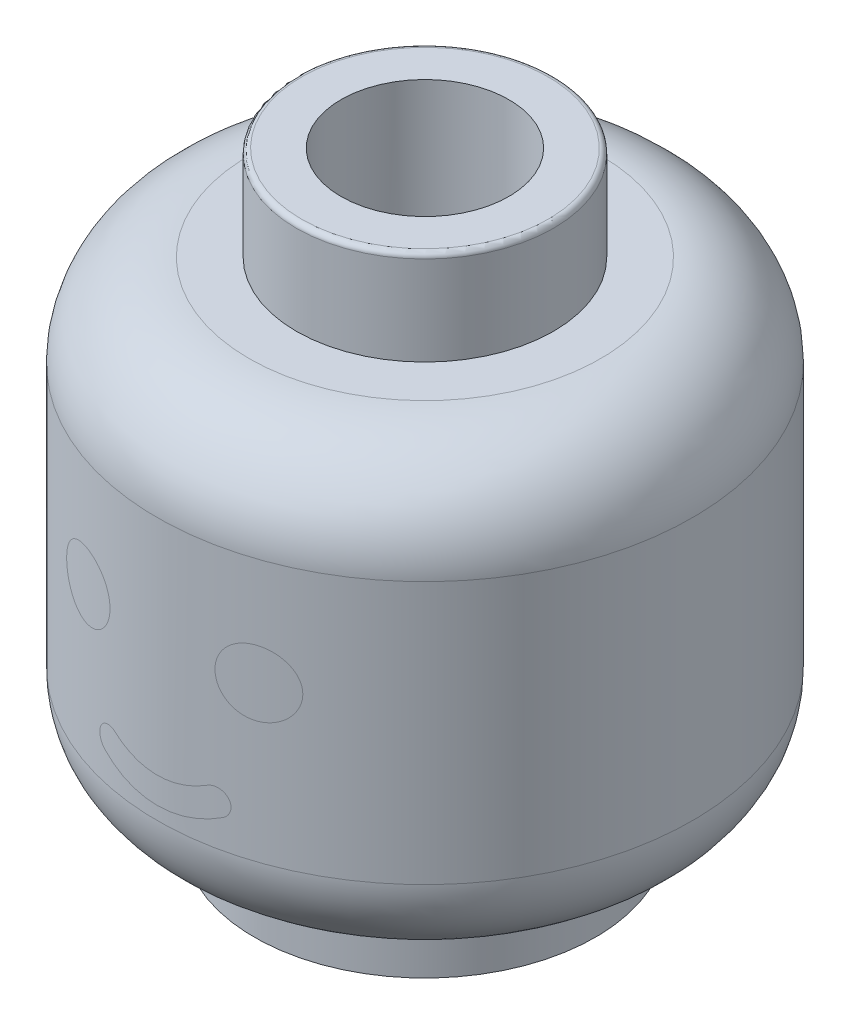
ISO-10303-21;
HEADER;
FILE_DESCRIPTION(('STEP AP214'),'2;1');
FILE_NAME('part.step','',(''),(''),'','','');
FILE_SCHEMA(('AUTOMOTIVE_DESIGN { 1 0 10303 214 1 1 1 1 }'));
ENDSEC;
DATA;
#1=APPLICATION_CONTEXT('core data for automotive mechanical design processes');
#2=APPLICATION_PROTOCOL_DEFINITION('international standard','automotive_design',2000,#1);
#3=PRODUCT_CONTEXT('',#1,'mechanical');
#4=PRODUCT('Part','Part','',(#3));
#5=PRODUCT_RELATED_PRODUCT_CATEGORY('part','',(#4));
#6=PRODUCT_DEFINITION_FORMATION('','',#4);
#7=PRODUCT_DEFINITION_CONTEXT('part definition',#1,'design');
#8=PRODUCT_DEFINITION('design','',#6,#7);
#9=PRODUCT_DEFINITION_SHAPE('','',#8);
#10=(LENGTH_UNIT() NAMED_UNIT(*) SI_UNIT(.MILLI.,.METRE.));
#11=(NAMED_UNIT(*) PLANE_ANGLE_UNIT() SI_UNIT($,.RADIAN.));
#12=(NAMED_UNIT(*) SI_UNIT($,.STERADIAN.) SOLID_ANGLE_UNIT());
#13=UNCERTAINTY_MEASURE_WITH_UNIT(LENGTH_MEASURE(1.E-05),#10,'distance_accuracy_value','');
#14=(GEOMETRIC_REPRESENTATION_CONTEXT(3) GLOBAL_UNCERTAINTY_ASSIGNED_CONTEXT((#13)) GLOBAL_UNIT_ASSIGNED_CONTEXT((#10,
#11,#12)) REPRESENTATION_CONTEXT('',''));
#15=CARTESIAN_POINT('',(0.,0.,0.));
#16=DIRECTION('',(0.,0.,1.));
#17=DIRECTION('',(1.,0.,0.));
#18=AXIS2_PLACEMENT_3D('',#15,#16,#17);
#19=CARTESIAN_POINT('',(0.,9.4,0.));
#20=DIRECTION('',(0.,1.,0.));
#21=DIRECTION('',(0.,0.,1.));
#22=AXIS2_PLACEMENT_3D('',#19,#20,#21);
#23=PLANE('',#22);
#24=DIRECTION('',(-0.866025403784443,0.,-0.499999999999992));
#25=VECTOR('',#24,1.);
#26=CARTESIAN_POINT('',(0.419999999999997,9.4,-0.242487113059647));
#27=LINE('',#26,#25);
#28=CARTESIAN_POINT('',(1.54704898937923,9.4,0.408214924348333));
#29=VERTEX_POINT('',#28);
#30=CARTESIAN_POINT('',(0.419999999999997,9.4,-0.242487113059647));
#31=VERTEX_POINT('',#30);
#32=EDGE_CURVE('E135',#29,#31,#27,.T.);
#33=ORIENTED_EDGE('',*,*,#32,.T.);
#34=DIRECTION('',(0.,0.,-1.));
#35=VECTOR('',#34,1.);
#36=CARTESIAN_POINT('',(0.419999999999978,9.4,-1.54389118787563));
#37=LINE('',#36,#35);
#38=CARTESIAN_POINT('',(0.419999999999978,9.4,-1.54389118787563));
#39=VERTEX_POINT('',#38);
#40=EDGE_CURVE('E126',#31,#39,#37,.T.);
#41=ORIENTED_EDGE('',*,*,#40,.T.);
#42=CARTESIAN_POINT('',(0.,9.4,0.));
#43=DIRECTION('',(0.,1.,0.));
#44=DIRECTION('',(0.,0.,1.));
#45=AXIS2_PLACEMENT_3D('',#42,#43,#44);
#46=CIRCLE('',#45,1.6);
#47=CARTESIAN_POINT('',(-0.42,9.4,-1.54389118787562));
#48=VERTEX_POINT('',#47);
#49=EDGE_CURVE('E134',#39,#48,#46,.T.);
#50=ORIENTED_EDGE('',*,*,#49,.T.);
#51=DIRECTION('',(0.,0.,1.));
#52=VECTOR('',#51,1.);
#53=CARTESIAN_POINT('',(-0.42,9.4,-0.242487113059642));
#54=LINE('',#53,#52);
#55=CARTESIAN_POINT('',(-0.42,9.4,-0.242487113059642));
#56=VERTEX_POINT('',#55);
#57=EDGE_CURVE('E170',#48,#56,#54,.T.);
#58=ORIENTED_EDGE('',*,*,#57,.T.);
#59=DIRECTION('',(-0.866025403784436,0.,0.500000000000004));
#60=VECTOR('',#59,1.);
#61=CARTESIAN_POINT('',(-1.54704898937922,9.4,0.408214924348355));
#62=LINE('',#61,#60);
#63=CARTESIAN_POINT('',(-1.54704898937922,9.4,0.408214924348354));
#64=VERTEX_POINT('',#63);
#65=EDGE_CURVE('E187',#56,#64,#62,.T.);
#66=ORIENTED_EDGE('',*,*,#65,.T.);
#67=CARTESIAN_POINT('',(-1.12704898937922,9.4,1.13567626352728));
#68=VERTEX_POINT('',#67);
#69=EDGE_CURVE('E204',#64,#68,#46,.T.);
#70=ORIENTED_EDGE('',*,*,#69,.T.);
#71=DIRECTION('',(0.866025403784436,0.,-0.500000000000004));
#72=VECTOR('',#71,1.);
#73=CARTESIAN_POINT('',(0.,9.4,0.484974226119285));
#74=LINE('',#73,#72);
#75=CARTESIAN_POINT('',(0.,9.4,0.484974226119285));
#76=VERTEX_POINT('',#75);
#77=EDGE_CURVE('E154',#68,#76,#74,.T.);
#78=ORIENTED_EDGE('',*,*,#77,.T.);
#79=DIRECTION('',(0.866025403784443,0.,0.499999999999992));
#80=VECTOR('',#79,1.);
#81=CARTESIAN_POINT('',(1.12704898937923,9.4,1.13567626352727));
#82=LINE('',#81,#80);
#83=CARTESIAN_POINT('',(1.12704898937923,9.4,1.13567626352727));
#84=VERTEX_POINT('',#83);
#85=EDGE_CURVE('E167',#76,#84,#82,.T.);
#86=ORIENTED_EDGE('',*,*,#85,.T.);
#87=EDGE_CURVE('E200',#84,#29,#46,.T.);
#88=ORIENTED_EDGE('',*,*,#87,.T.);
#89=EDGE_LOOP('',(#33,#41,#50,#58,#66,#70,#78,#86,#88));
#90=FACE_BOUND('',#89,.T.);
#91=ADVANCED_FACE('F36',(#90),#23,.T.);
#92=CARTESIAN_POINT('',(0.,0.,0.));
#93=DIRECTION('',(0.,-1.,0.));
#94=DIRECTION('',(0.,0.,-1.));
#95=AXIS2_PLACEMENT_3D('',#92,#93,#94);
#96=CYLINDRICAL_SURFACE('',#95,5.1);
#97=CARTESIAN_POINT('',(0.875000000000001,3.83445554337723,5.0243780709656));
#98=CARTESIAN_POINT('',(0.834164436280925,3.81088049752348,5.03149100963561));
#99=CARTESIAN_POINT('',(0.792347844589759,3.78893844223863,5.03825831000549));
#100=CARTESIAN_POINT('',(0.706965208696133,3.74845814129846,5.05094683060711));
#101=CARTESIAN_POINT('',(0.66339880943275,3.72992059076176,5.05686787799957));
#102=CARTESIAN_POINT('',(0.530503627881056,3.67966677176317,5.07311487801817));
#103=CARTESIAN_POINT('',(0.43890058846477,3.65326409982503,5.08193876661321));
#104=CARTESIAN_POINT('',(0.252167371311598,3.61563911749123,5.09462377308676));
#105=CARTESIAN_POINT('',(0.157031617465066,3.60444195365849,5.09847666951475));
#106=CARTESIAN_POINT('',(-0.0338435259914939,3.59772661788917,5.10077941625791));
#107=CARTESIAN_POINT('',(-0.129582682402315,3.60220272000981,5.09923123975764));
#108=CARTESIAN_POINT('',(-0.31669351817545,3.62636508485874,5.09100139919587));
#109=CARTESIAN_POINT('',(-0.408114966530228,3.64571210384434,5.08443424960048));
#110=CARTESIAN_POINT('',(-0.586288365896085,3.69852240222104,5.06697757552819));
#111=CARTESIAN_POINT('',(-0.673045563744544,3.73196942924805,5.05609302834729));
#112=CARTESIAN_POINT('',(-0.776531562683269,3.78155988530873,5.04057755815767));
#113=CARTESIAN_POINT('',(-0.7965419111866,3.79162783876802,5.03745232543941));
#114=CARTESIAN_POINT('',(-0.83610640638027,3.81249434086526,5.03103611531888));
#115=CARTESIAN_POINT('',(-0.855661273279768,3.82329161347498,5.0277454298491));
#116=CARTESIAN_POINT('',(-0.875,3.83445554337723,5.0243780709656));
#117=B_SPLINE_CURVE_WITH_KNOTS('',3,(#97,#98,#99,#100,#101,#102,#103,#104,#105,#106,#107,#108,
#109,#110,#111,#112,#113,#114,#115,#116),.UNSPECIFIED.,.F.,.F.,(4,2,2,2,2,2,2,2,2,4),(0.,
0.142977774593221,0.285984709459801,0.571727466948214,0.857942206903047,1.14405239441726,
1.42382259326841,1.703271193143,1.77111422851297,1.8388414943344),.UNSPECIFIED.);
#118=CARTESIAN_POINT('',(0.875000000000001,3.83445554337723,5.0243780709656));
#119=VERTEX_POINT('',#118);
#120=CARTESIAN_POINT('',(-0.875,3.83445554337723,5.0243780709656));
#121=VERTEX_POINT('',#120);
#122=EDGE_CURVE('E320',#119,#121,#117,.T.);
#123=ORIENTED_EDGE('',*,*,#122,.T.);
#124=CARTESIAN_POINT('',(-0.875,3.83445554337723,5.0243780709656));
#125=CARTESIAN_POINT('',(-0.887371793979468,3.84161189032588,5.02222559463594));
#126=CARTESIAN_POINT('',(-0.900340825244154,3.84767185938982,5.01991800503832));
#127=CARTESIAN_POINT('',(-0.927059864778855,3.85749135759363,5.01505118951027));
#128=CARTESIAN_POINT('',(-0.940808862372179,3.86125379267305,5.01249228622124));
#129=CARTESIAN_POINT('',(-0.968708678047118,3.86638936803659,5.00717551081821));
#130=CARTESIAN_POINT('',(-0.982859524008575,3.86776234212864,5.00441762487843));
#131=CARTESIAN_POINT('',(-1.01116411478936,3.86810032456663,4.99877535176141));
#132=CARTESIAN_POINT('',(-1.02531785967492,3.86706526981954,4.99589096127155));
#133=CARTESIAN_POINT('',(-1.0533862709173,3.86259994503797,4.99004861209086));
#134=CARTESIAN_POINT('',(-1.06729685929801,3.85914460749975,4.98709019876404));
#135=CARTESIAN_POINT('',(-1.09433736519577,3.84990742838682,4.98122648358215));
#136=CARTESIAN_POINT('',(-1.10746716175147,3.84412522740335,4.97832119000449));
#137=CARTESIAN_POINT('',(-1.13262058247588,3.83035938373142,4.97265900803936));
#138=CARTESIAN_POINT('',(-1.14463985912168,3.82236754054938,4.9699027191095));
#139=CARTESIAN_POINT('',(-1.16716110363957,3.80440187116274,4.9646620075731));
#140=CARTESIAN_POINT('',(-1.17766322756655,3.7944282490557,4.96217755701155));
#141=CARTESIAN_POINT('',(-1.19669465521119,3.77291577884772,4.95762207076145));
#142=CARTESIAN_POINT('',(-1.20524885165249,3.76140006781182,4.95554587116217));
#143=CARTESIAN_POINT('',(-1.2202885675878,3.7370205158325,4.9518638926501));
#144=CARTESIAN_POINT('',(-1.22677439020682,3.72415687279911,4.95025804480897));
#145=CARTESIAN_POINT('',(-1.23731153938216,3.69781783607033,4.94763468769716));
#146=CARTESIAN_POINT('',(-1.24142374817177,3.68436826145712,4.94660249306853));
#147=CARTESIAN_POINT('',(-1.2473386841379,3.65694020257054,4.94511432232711));
#148=CARTESIAN_POINT('',(-1.24914178969092,3.6429618053382,4.94465825180907));
#149=CARTESIAN_POINT('',(-1.25036114021336,3.61522854845824,4.94435004554774));
#150=CARTESIAN_POINT('',(-1.24983303828501,3.601476261082,4.94448382810274));
#151=CARTESIAN_POINT('',(-1.2465345533237,3.57426222014632,4.9453164149885));
#152=CARTESIAN_POINT('',(-1.24376437901751,3.56080043966178,4.94601516672318));
#153=CARTESIAN_POINT('',(-1.23609106012093,3.5346032456278,4.94793839100754));
#154=CARTESIAN_POINT('',(-1.23119710230879,3.52186496786532,4.949160598966));
#155=CARTESIAN_POINT('',(-1.21943147563355,3.49739112018165,4.95207263598187));
#156=CARTESIAN_POINT('',(-1.2125590826936,3.48565591941425,4.95376263623533));
#157=CARTESIAN_POINT('',(-1.19690134031722,3.46328911077548,4.95756928685665));
#158=CARTESIAN_POINT('',(-1.18808309735189,3.45268180229299,4.95969322021645));
#159=CARTESIAN_POINT('',(-1.16887719960701,3.43310324751312,4.96425449031675));
#160=CARTESIAN_POINT('',(-1.15849150543121,3.42412998782294,4.96669143497619));
#161=CARTESIAN_POINT('',(-1.14023874760394,3.41079251405107,4.97090652795668));
#162=CARTESIAN_POINT('',(-1.13273529764303,3.40590499349084,4.9726226993017));
#163=CARTESIAN_POINT('',(-1.125,3.40144284148501,4.97437181963713));
#164=B_SPLINE_CURVE_WITH_KNOTS('',3,(#124,#125,#126,#127,#128,#129,#130,#131,#132,#133,#134,
#135,#136,#137,#138,#139,#140,#141,#142,#143,#144,#145,#146,#147,#148,#149,#150,#151,#152,#153,
#154,#155,#156,#157,#158,#159,#160,#161,#162,#163),.UNSPECIFIED.,.F.,.F.,(4,2,2,2,2,2,2,2,2,2,2,
2,2,2,2,2,2,2,2,4),(0.,0.0432964300031916,0.0865379842893045,0.129782545996899,
0.173028240772797,0.2167285958122,0.260435703427691,0.304307247376252,0.348174275463554,
0.391444586081846,0.434708552417919,0.476806902772313,0.518898353882955,0.559990458102317,
0.601078737273161,0.64199102676717,0.682918308607407,0.724599191076423,0.766228363734424,
0.793527918289852),.UNSPECIFIED.);
#165=CARTESIAN_POINT('',(-1.125,3.40144284148502,4.97437181963713));
#166=VERTEX_POINT('',#165);
#167=EDGE_CURVE('E208',#121,#166,#164,.T.);
#168=ORIENTED_EDGE('',*,*,#167,.T.);
#169=CARTESIAN_POINT('',(-1.125,3.40144284148502,4.97437181963713));
#170=CARTESIAN_POINT('',(-1.07392735204476,3.3719583579169,4.98592412552557));
#171=CARTESIAN_POINT('',(-1.02162134379315,3.34443642841755,4.99692384947784));
#172=CARTESIAN_POINT('',(-0.914772205039753,3.29349759120265,5.01758462706758));
#173=CARTESIAN_POINT('',(-0.860228320479516,3.27008208140849,5.02724522460141));
#174=CARTESIAN_POINT('',(-0.6936603634674,3.20630197843225,5.05385291199249));
#175=CARTESIAN_POINT('',(-0.578679160673211,3.17239175102317,5.06843075392214));
#176=CARTESIAN_POINT('',(-0.343836701569872,3.12318267685322,5.08976616301442));
#177=CARTESIAN_POINT('',(-0.223964564545564,3.10792795994343,5.09650518551788));
#178=CARTESIAN_POINT('',(0.0167749322450367,3.0968442934725,5.10139030813886));
#179=CARTESIAN_POINT('',(0.137641329911959,3.10099836605598,5.09954391835996));
#180=CARTESIAN_POINT('',(0.372544852768561,3.12801449726199,5.0876895268438));
#181=CARTESIAN_POINT('',(0.486673534134241,3.15022378949166,5.07796634418309));
#182=CARTESIAN_POINT('',(0.70940931669795,3.21164460444894,5.0516627621416));
#183=CARTESIAN_POINT('',(0.818019156601206,3.25084760021018,5.03508580198764));
#184=CARTESIAN_POINT('',(0.957225886936982,3.31341547626634,5.00948888390476));
#185=CARTESIAN_POINT('',(0.991502231445824,3.32988385291635,5.00281111664259));
#186=CARTESIAN_POINT('',(1.05901769647691,3.36444915483163,4.98895389551433));
#187=CARTESIAN_POINT('',(1.09225901036436,3.38254226847989,4.98177562424215));
#188=CARTESIAN_POINT('',(1.12500000000001,3.40144284148499,4.97437181963713));
#189=B_SPLINE_CURVE_WITH_KNOTS('',3,(#169,#170,#171,#172,#173,#174,#175,#176,#177,#178,#179,
#180,#181,#182,#183,#184,#185,#186,#187,#188),.UNSPECIFIED.,.F.,.F.,(4,2,2,2,2,2,2,2,2,4),(0.,
0.18018627349106,0.360433768038077,0.720855984508415,1.08212914544494,1.44308634156823,
1.79154497487549,2.13982896338777,2.2556209280237,2.37114800911496),.UNSPECIFIED.);
#190=CARTESIAN_POINT('',(1.125,3.40144284148501,4.97437181963713));
#191=VERTEX_POINT('',#190);
#192=EDGE_CURVE('E332',#166,#191,#189,.T.);
#193=ORIENTED_EDGE('',*,*,#192,.T.);
#194=CARTESIAN_POINT('',(1.125,3.40144284148501,4.97437181963713));
#195=CARTESIAN_POINT('',(1.13716081478622,3.40845137343036,4.9716223804379));
#196=CARTESIAN_POINT('',(1.1487358996211,3.41651114654839,4.96895680479547));
#197=CARTESIAN_POINT('',(1.1704131716666,3.43449261769338,4.96389513184671));
#198=CARTESIAN_POINT('',(1.18051465090312,3.44441520548367,4.9614991641955));
#199=CARTESIAN_POINT('',(1.1989409082874,3.46588606707104,4.95707892158935));
#200=CARTESIAN_POINT('',(1.20726377064395,3.47743607180735,4.95505504775002));
#201=CARTESIAN_POINT('',(1.22185052310068,3.50182848216086,4.95147833941408));
#202=CARTESIAN_POINT('',(1.22811567975787,3.51467008639098,4.9499252152077));
#203=CARTESIAN_POINT('',(1.23827803335463,3.54101458018042,4.9473927070547));
#204=CARTESIAN_POINT('',(1.24222005242811,3.55449912458908,4.94640247704257));
#205=CARTESIAN_POINT('',(1.24779390126013,3.58196925885039,4.94499937055623));
#206=CARTESIAN_POINT('',(1.24942555759097,3.59595488623613,4.94458653742444));
#207=CARTESIAN_POINT('',(1.25030994719144,3.62367913558669,4.94436297240571));
#208=CARTESIAN_POINT('',(1.24961710744629,3.63741594049061,4.94453846507086));
#209=CARTESIAN_POINT('',(1.24599600554664,3.66457058426607,4.94545219168911));
#210=CARTESIAN_POINT('',(1.24306801064931,3.67798846107403,4.94619035836334));
#211=CARTESIAN_POINT('',(1.23508739747892,3.70408587077959,4.94818914590149));
#212=CARTESIAN_POINT('',(1.23004176169731,3.71676767569775,4.94944804954579));
#213=CARTESIAN_POINT('',(1.21798634485784,3.74110101291393,4.95242845896087));
#214=CARTESIAN_POINT('',(1.21097635926816,3.75275243776054,4.9541500129029));
#215=CARTESIAN_POINT('',(1.19505563947278,3.7749302481124,4.95801473732174));
#216=CARTESIAN_POINT('',(1.18611217444627,3.7854318647845,4.96016511111878));
#217=CARTESIAN_POINT('',(1.16666530730711,3.80479412045166,4.96477509632718));
#218=CARTESIAN_POINT('',(1.1561616930271,3.81365453588816,4.96723474979101));
#219=CARTESIAN_POINT('',(1.13357483159417,3.82973972281286,4.97243862180976));
#220=CARTESIAN_POINT('',(1.12145597318891,3.83691256994625,4.97518882287083));
#221=CARTESIAN_POINT('',(1.09621196261841,3.84911987242397,4.98081182631213));
#222=CARTESIAN_POINT('',(1.08308673562136,3.85415416856701,4.9836846378024));
#223=CARTESIAN_POINT('',(1.05591550914695,3.86203418345876,4.98951291689665));
#224=CARTESIAN_POINT('',(1.04185638022513,3.86483433313183,4.9924688913932));
#225=CARTESIAN_POINT('',(1.01344740181333,3.86799613128861,4.99831317826902));
#226=CARTESIAN_POINT('',(0.999097453432221,3.86835693584657,5.00120146688705));
#227=CARTESIAN_POINT('',(0.970461701171136,3.86661394764592,5.0068371392492));
#228=CARTESIAN_POINT('',(0.956176361389042,3.86450059824756,5.00958393355742));
#229=CARTESIAN_POINT('',(0.928162193094747,3.85783630488362,5.01484962728933));
#230=CARTESIAN_POINT('',(0.914432518491479,3.85328922937807,5.0173688809867));
#231=CARTESIAN_POINT('',(0.892213126665928,3.84373273822947,5.02135852358233));
#232=CARTESIAN_POINT('',(0.883464228476502,3.83934791345587,5.02290471758503));
#233=CARTESIAN_POINT('',(0.875,3.83445554337723,5.0243780709656));
#234=B_SPLINE_CURVE_WITH_KNOTS('',3,(#194,#195,#196,#197,#198,#199,#200,#201,#202,#203,#204,
#205,#206,#207,#208,#209,#210,#211,#212,#213,#214,#215,#216,#217,#218,#219,#220,#221,#222,#223,
#224,#225,#226,#227,#228,#229,#230,#231,#232,#233),.UNSPECIFIED.,.F.,.F.,(4,2,2,2,2,2,2,2,2,2,2,
2,2,2,2,2,2,2,2,4),(0.,0.0428611703448275,0.085742865423625,0.128670519167903,0.171571700388239,
0.213615486024651,0.255662427516381,0.296731795213066,0.337796253020309,0.378726359860853,
0.419660730006126,0.461351541613419,0.503048028024636,0.5458959471854,0.58874705553804,
0.632451309080979,0.676170681951485,0.720059483470533,0.763878729077869,0.793533236837038),.UNSPECIFIED.);
#235=EDGE_CURVE('E338',#191,#119,#234,.T.);
#236=ORIENTED_EDGE('',*,*,#235,.T.);
#237=EDGE_LOOP('',(#123,#168,#193,#236));
#238=FACE_BOUND('',#237,.T.);
#239=ADVANCED_FACE('F247',(#238),#96,.T.);
#240=CARTESIAN_POINT('',(2.25,5.8,4.57684389071771));
#241=CARTESIAN_POINT('',(2.24999821093017,5.83268089963055,4.57684509570473));
#242=CARTESIAN_POINT('',(2.24742352409958,5.86538489408024,4.57811328492607));
#243=CARTESIAN_POINT('',(2.23723923988095,5.92982746387808,4.58309842089861));
#244=CARTESIAN_POINT('',(2.2296236871884,5.96156485082564,4.58681826402382));
#245=CARTESIAN_POINT('',(2.20972563417215,6.02307550216269,4.59643701994647));
#246=CARTESIAN_POINT('',(2.19745714026951,6.05285434958025,4.60232939146728));
#247=CARTESIAN_POINT('',(2.16872735700624,6.10984643065151,4.61593687371031));
#248=CARTESIAN_POINT('',(2.15226598984845,6.13705961668749,4.6236520182532));
#249=CARTESIAN_POINT('',(2.11478116282377,6.18965729951401,4.64092079738532));
#250=CARTESIAN_POINT('',(2.09357355176423,6.21488664973334,4.65054604251694));
#251=CARTESIAN_POINT('',(2.04774396214306,6.26149973202262,4.67090713008831));
#252=CARTESIAN_POINT('',(2.02312072258144,6.28288203709214,4.68164338232208));
#253=CARTESIAN_POINT('',(1.96863294630213,6.32325438853096,4.70483142166591));
#254=CARTESIAN_POINT('',(1.93849385989209,6.34183628921375,4.71734986328975));
#255=CARTESIAN_POINT('',(1.8756221450062,6.37363362683435,4.74269871488975));
#256=CARTESIAN_POINT('',(1.8428885923984,6.38684714122857,4.75552923488804));
#257=CARTESIAN_POINT('',(1.77374872752115,6.40817620199162,4.78176274034261));
#258=CARTESIAN_POINT('',(1.73723941258804,6.41596926971248,4.79515812651366));
#259=CARTESIAN_POINT('',(1.66319810445617,6.42494513246531,4.8213394007919));
#260=CARTESIAN_POINT('',(1.62566609584257,6.4261278278051,4.83412527970411));
#261=CARTESIAN_POINT('',(1.55088062129565,6.42171217210202,4.85863237780584));
#262=CARTESIAN_POINT('',(1.51362678405204,6.41615229647463,4.87035923138294));
#263=CARTESIAN_POINT('',(1.44036847775789,6.39829457169771,4.89252517813363));
#264=CARTESIAN_POINT('',(1.40436368656999,6.38599847381056,4.90296460514461));
#265=CARTESIAN_POINT('',(1.33639539895269,6.35556909177676,4.92191412051277));
#266=CARTESIAN_POINT('',(1.30432354450727,6.33771842593868,4.93048917679626));
#267=CARTESIAN_POINT('',(1.2435654663394,6.29646732114622,4.94616317050037));
#268=CARTESIAN_POINT('',(1.21487835175153,6.27306834741127,4.95326249671038));
#269=CARTESIAN_POINT('',(1.16310412919168,6.22252536819747,4.96566892599652));
#270=CARTESIAN_POINT('',(1.13982463085653,6.19559434810234,4.97104172369588));
#271=CARTESIAN_POINT('',(1.09808908475715,6.13801409864679,4.98042762525543));
#272=CARTESIAN_POINT('',(1.07963229089318,6.10736544550078,4.98444093946394));
#273=CARTESIAN_POINT('',(1.04858778512332,6.04409684374799,4.99106302869871));
#274=CARTESIAN_POINT('',(1.03585885464257,6.01154966776167,4.99370587652689));
#275=CARTESIAN_POINT('',(1.01598778237418,5.94472062121609,4.99778677372652));
#276=CARTESIAN_POINT('',(1.0088452568402,5.91043886998211,4.99922490585386));
#277=CARTESIAN_POINT('',(1.00042397857505,5.84150619899965,5.00091694997969));
#278=CARTESIAN_POINT('',(0.999083597488843,5.80686309715794,5.00118330864447));
#279=CARTESIAN_POINT('',(1.00214002979624,5.73784159603897,5.00057173712213));
#280=CARTESIAN_POINT('',(1.00653668886168,5.70346318966634,4.99969383771592));
#281=CARTESIAN_POINT('',(1.02091046741958,5.63602855613549,4.99677844163824));
#282=CARTESIAN_POINT('',(1.03087468424415,5.60296946061132,4.99474362589915));
#283=CARTESIAN_POINT('',(1.05605752736804,5.53902036524975,4.98947962611299));
#284=CARTESIAN_POINT('',(1.07127610288316,5.5081303444514,4.98625045360955));
#285=CARTESIAN_POINT('',(1.10654472335407,5.44927193306245,4.97854239136448));
#286=CARTESIAN_POINT('',(1.12661116930954,5.42131393245402,4.97405925097897));
#287=CARTESIAN_POINT('',(1.1709086224938,5.36919150116225,4.96381792715512));
#288=CARTESIAN_POINT('',(1.19513973935135,5.34502717037368,4.95805971015114));
#289=CARTESIAN_POINT('',(1.247331635441,5.30082520152454,4.94518893131065));
#290=CARTESIAN_POINT('',(1.27533495137311,5.28084247211134,4.93806045530358));
#291=CARTESIAN_POINT('',(1.33396784273672,5.24584159560948,4.92254494847851));
#292=CARTESIAN_POINT('',(1.36459769549665,5.23082397358702,4.914157784689));
#293=CARTESIAN_POINT('',(1.42846052470691,5.20568770075081,4.89598118116687));
#294=CARTESIAN_POINT('',(1.46174208100307,5.19571611825991,4.8861593593167));
#295=CARTESIAN_POINT('',(1.52918127815087,5.18142686044168,4.86547524519933));
#296=CARTESIAN_POINT('',(1.56333910276756,5.17711038111184,4.85461273335776));
#297=CARTESIAN_POINT('',(1.63313206050846,5.17403538725213,4.8315926381899));
#298=CARTESIAN_POINT('',(1.66876640880608,5.17552844037567,4.81939917861963));
#299=CARTESIAN_POINT('',(1.73908614337535,5.18447858695583,4.79447314128542));
#300=CARTESIAN_POINT('',(1.77377127564805,5.19193726091131,4.78174042149958));
#301=CARTESIAN_POINT('',(1.84282835380547,5.21302838649581,4.75556578085646));
#302=CARTESIAN_POINT('',(1.87711962140943,5.22691763030354,4.74211727490861));
#303=CARTESIAN_POINT('',(1.94283937523909,5.26058664283049,4.71557341915411));
#304=CARTESIAN_POINT('',(1.97426728063138,5.28036760322642,4.70247814137742));
#305=CARTESIAN_POINT('',(2.0336243769326,5.32560003480396,4.67711697517972));
#306=CARTESIAN_POINT('',(2.06152093769916,5.35109909528098,4.66485924465043));
#307=CARTESIAN_POINT('',(2.11255598263187,5.40712786786091,4.641970605721));
#308=CARTESIAN_POINT('',(2.13569478139474,5.43765724710426,4.63133958976979));
#309=CARTESIAN_POINT('',(2.17509710786169,5.50111267825925,4.61295998744394));
#310=CARTESIAN_POINT('',(2.19167582030666,5.53380504064523,4.6050822452227));
#311=CARTESIAN_POINT('',(2.2189449995419,5.60201898303534,4.5920055529927));
#312=CARTESIAN_POINT('',(2.22964830953976,5.63753419621972,4.58680076172451));
#313=CARTESIAN_POINT('',(2.24139677682865,5.69451072116627,4.58106549185679));
#314=CARTESIAN_POINT('',(2.24461602880037,5.71544364516775,4.57948736746911));
#315=CARTESIAN_POINT('',(2.24891816697547,5.75758114478951,4.57737620225752));
#316=CARTESIAN_POINT('',(2.25000116134662,5.7787857066009,4.57684310851928));
#317=CARTESIAN_POINT('',(2.25,5.8,4.57684389071771));
#318=B_SPLINE_CURVE_WITH_KNOTS('',3,(#240,#241,#242,#243,#244,#245,#246,#247,#248,#249,#250,
#251,#252,#253,#254,#255,#256,#257,#258,#259,#260,#261,#262,#263,#264,#265,#266,#267,#268,#269,
#270,#271,#272,#273,#274,#275,#276,#277,#278,#279,#280,#281,#282,#283,#284,#285,#286,#287,#288,
#289,#290,#291,#292,#293,#294,#295,#296,#297,#298,#299,#300,#301,#302,#303,#304,#305,#306,#307,
#308,#309,#310,#311,#312,#313,#314,#315,#316,#317),.UNSPECIFIED.,.T.,.F.,(4,2,2,2,2,2,2,2,2,2,2,
2,2,2,2,2,2,2,2,2,2,2,2,2,2,2,2,2,2,2,2,2,2,2,2,2,2,2,4),(0.,0.0979599375773447,
0.19603581257495,0.293818770289086,0.391603542461189,0.494184159702283,0.596802749499285,
0.708976625992396,0.821190639215509,0.939612702968071,1.0580365526597,1.1757878033801,
1.29350845600906,1.40601578351146,1.51849343265248,1.62596591030116,1.73342175149066,
1.83805966032882,1.94269038065465,2.046206979861,2.14972079449597,2.25299570765941,
2.35626962268268,2.45989794429762,2.56352899419187,2.66844555479927,2.77337320691538,
2.88120449766342,2.9890585899662,3.10163392771462,3.21423910043866,3.33179045133175,
3.4493655946871,3.56795819196073,3.68654294503193,3.79841103740179,3.91003361037509,
3.97362598739754,4.03721514438575),.UNSPECIFIED.);
#319=CARTESIAN_POINT('',(2.25,5.8,4.57684389071771));
#320=VERTEX_POINT('',#319);
#321=EDGE_CURVE('E311',#320,#320,#318,.T.);
#322=ORIENTED_EDGE('',*,*,#321,.T.);
#323=EDGE_LOOP('',(#322));
#324=FACE_BOUND('',#323,.T.);
#325=ADVANCED_FACE('F252',(#324),#96,.T.);
#326=CARTESIAN_POINT('',(-1.,5.8,5.00099990002));
#327=CARTESIAN_POINT('',(-1.00000151690153,5.834511838437,5.00099990712765));
#328=CARTESIAN_POINT('',(-1.00286876052158,5.8690463588851,5.00042890994423));
#329=CARTESIAN_POINT('',(-1.01425646627887,5.93715693314022,4.99813127779737));
#330=CARTESIAN_POINT('',(-1.02278306702181,5.97073190484821,4.99640338795486));
#331=CARTESIAN_POINT('',(-1.04521458875839,6.03592576368567,4.99175889029626));
#332=CARTESIAN_POINT('',(-1.05911613407239,6.06754586412378,4.98884302851232));
#333=CARTESIAN_POINT('',(-1.09185026684241,6.12795824840589,4.98178100126432));
#334=CARTESIAN_POINT('',(-1.11068171939305,6.15675118099229,4.97763511893192));
#335=CARTESIAN_POINT('',(-1.15277623531479,6.21086514077664,4.96805530875786));
#336=CARTESIAN_POINT('',(-1.17605952865221,6.23616937453975,4.96261547229567));
#337=CARTESIAN_POINT('',(-1.22626351158888,6.28249474903862,4.9504488375796));
#338=CARTESIAN_POINT('',(-1.25318449775082,6.30351554021618,4.94372193437907));
#339=CARTESIAN_POINT('',(-1.31032858774834,6.34110690842641,4.92888668070293));
#340=CARTESIAN_POINT('',(-1.34060084855158,6.35759401420153,4.92075640207097));
#341=CARTESIAN_POINT('',(-1.40313946905718,6.38529755291533,4.90329006920268));
#342=CARTESIAN_POINT('',(-1.43540611634181,6.3965132237193,4.89395384086089));
#343=CARTESIAN_POINT('',(-1.50214797051841,6.41380858839688,4.87389020382693));
#344=CARTESIAN_POINT('',(-1.53666096976907,6.41969957292037,4.86312614436147));
#345=CARTESIAN_POINT('',(-1.6058968164829,6.42567433524797,4.8407045714223));
#346=CARTESIAN_POINT('',(-1.6406197113844,6.42575674713349,4.82904684844376));
#347=CARTESIAN_POINT('',(-1.71101143225061,6.42010588871324,4.80456989248105));
#348=CARTESIAN_POINT('',(-1.74664840079208,6.41410007319685,4.79172183174764));
#349=CARTESIAN_POINT('',(-1.81628042291799,6.39609641984108,4.7657641451245));
#350=CARTESIAN_POINT('',(-1.85027501952491,6.38409692471699,4.75265444785392));
#351=CARTESIAN_POINT('',(-1.91694272819715,6.35387822275484,4.72616784257355));
#352=CARTESIAN_POINT('',(-1.94952527278676,6.33545217289644,4.71279811486469));
#353=CARTESIAN_POINT('',(-2.01110344261868,6.29289933745975,4.68685188814152));
#354=CARTESIAN_POINT('',(-2.04009866749996,6.26877191645562,4.67427547774164));
#355=CARTESIAN_POINT('',(-2.09319922337433,6.21569691499744,4.65073651527793));
#356=CARTESIAN_POINT('',(-2.1173665136775,6.18682044840835,4.63975408682706));
#357=CARTESIAN_POINT('',(-2.16036994898472,6.12469748254316,4.61988795561479));
#358=CARTESIAN_POINT('',(-2.17920930829465,6.09145363588584,4.61100298800605));
#359=CARTESIAN_POINT('',(-2.20941882839442,6.02433229941903,4.59659956061496));
#360=CARTESIAN_POINT('',(-2.22126265230069,5.99071388292109,4.59087008544554));
#361=CARTESIAN_POINT('',(-2.23908788005507,5.92161862047672,4.58220318037648));
#362=CARTESIAN_POINT('',(-2.24507374341309,5.88614320991995,4.57926362663521));
#363=CARTESIAN_POINT('',(-2.25059255570592,5.81790635267924,4.57655336681333));
#364=CARTESIAN_POINT('',(-2.25067299386433,5.78519870951082,4.57651380446296));
#365=CARTESIAN_POINT('',(-2.24574719214254,5.72026706328799,4.57893296336695));
#366=CARTESIAN_POINT('',(-2.24074178733327,5.68804298171654,4.58139127448252));
#367=CARTESIAN_POINT('',(-2.22608462579069,5.6258901879866,4.58853031334332));
#368=CARTESIAN_POINT('',(-2.21656498636765,5.59592266382469,4.59314779857097));
#369=CARTESIAN_POINT('',(-2.19331529867523,5.53805402711585,4.60429509999728));
#370=CARTESIAN_POINT('',(-2.17958445730978,5.51015330503984,4.61082527640283));
#371=CARTESIAN_POINT('',(-2.14751640124844,5.45553083201398,4.62585155734728));
#372=CARTESIAN_POINT('',(-2.12896763856847,5.42895795848918,4.63443592664681));
#373=CARTESIAN_POINT('',(-2.08827515536961,5.37924574298519,4.65291370695865));
#374=CARTESIAN_POINT('',(-2.06613005649317,5.35610772400706,4.6628076196059));
#375=CARTESIAN_POINT('',(-2.01661947702173,5.31167083487721,4.68444661193492));
#376=CARTESIAN_POINT('',(-1.98896042974994,5.29074093711521,4.69627827255092));
#377=CARTESIAN_POINT('',(-1.93075163098336,5.2538038262966,4.72050766328082));
#378=CARTESIAN_POINT('',(-1.90020077240919,5.23779850857771,4.73290560923961));
#379=CARTESIAN_POINT('',(-1.83468606470462,5.21007712727819,4.7587025671708));
#380=CARTESIAN_POINT('',(-1.79956293002442,5.19874398947867,4.77211042099349));
#381=CARTESIAN_POINT('',(-1.72774336013291,5.18240359060501,4.79857974928233));
#382=CARTESIAN_POINT('',(-1.69104671714969,5.17739716760989,4.81164117763434));
#383=CARTESIAN_POINT('',(-1.61664596965983,5.17393485177328,4.83714990055694));
#384=CARTESIAN_POINT('',(-1.57893511386604,5.17555573167958,4.84958829808962));
#385=CARTESIAN_POINT('',(-1.50407182859974,5.18564916048144,4.8733262954358));
#386=CARTESIAN_POINT('',(-1.46691928529337,5.19412029283641,4.88462613014563));
#387=CARTESIAN_POINT('',(-1.39576310243052,5.21739871498445,4.9054224592002));
#388=CARTESIAN_POINT('',(-1.36169374671174,5.23195875550065,4.9149703759735));
#389=CARTESIAN_POINT('',(-1.29638270127521,5.26707507364988,4.93259935455762));
#390=CARTESIAN_POINT('',(-1.26514011132263,5.2876294334138,4.94068088419624));
#391=CARTESIAN_POINT('',(-1.20800798557652,5.33308295004981,4.95495150096601));
#392=CARTESIAN_POINT('',(-1.1819342574582,5.35772825876253,4.96121244028702));
#393=CARTESIAN_POINT('',(-1.13426011235918,5.4113042057867,4.97232890416605));
#394=CARTESIAN_POINT('',(-1.11265989194766,5.44023503231115,4.97718436697015));
#395=CARTESIAN_POINT('',(-1.07529307207803,5.50055535471623,4.98538869981985));
#396=CARTESIAN_POINT('',(-1.05936427945246,5.53183882323217,4.9887801739823));
#397=CARTESIAN_POINT('',(-1.032954651942,5.59670115837605,4.99431561319897));
#398=CARTESIAN_POINT('',(-1.02246725616904,5.63027720519756,4.99646108098232));
#399=CARTESIAN_POINT('',(-1.00993089238961,5.68671149443279,4.99900623651242));
#400=CARTESIAN_POINT('',(-1.00621232443705,5.70919782959394,4.99975431794545));
#401=CARTESIAN_POINT('',(-1.00124638691545,5.75445281761336,5.00075114548123));
#402=CARTESIAN_POINT('',(-0.999998998813423,5.77722146835309,5.0009998953288));
#403=CARTESIAN_POINT('',(-1.,5.8,5.00099990002));
#404=B_SPLINE_CURVE_WITH_KNOTS('',3,(#326,#327,#328,#329,#330,#331,#332,#333,#334,#335,#336,
#337,#338,#339,#340,#341,#342,#343,#344,#345,#346,#347,#348,#349,#350,#351,#352,#353,#354,#355,
#356,#357,#358,#359,#360,#361,#362,#363,#364,#365,#366,#367,#368,#369,#370,#371,#372,#373,#374,
#375,#376,#377,#378,#379,#380,#381,#382,#383,#384,#385,#386,#387,#388,#389,#390,#391,#392,#393,
#394,#395,#396,#397,#398,#399,#400,#401,#402,#403),.UNSPECIFIED.,.T.,.F.,(4,2,2,2,2,2,2,2,2,2,2,
2,2,2,2,2,2,2,2,2,2,2,2,2,2,2,2,2,2,2,2,2,2,2,2,2,2,2,4),(0.,0.10345220201391,0.207016800604948,
0.310516461871601,0.413992317580975,0.517950069215874,0.621916301119247,0.727684988413026,
0.833468962855265,0.942869685506748,1.05229613426876,1.16684732578833,1.28143020887799,
1.40010567833363,1.51879438058107,1.63584516059708,1.75282517326617,1.86053319153262,
1.96815915061096,2.06579322859094,2.16341127811561,2.25833377892936,2.35327416749598,
2.4534281003628,2.55362050993002,2.66309505897257,2.77261168925676,2.88986568072622,
3.00713520281728,3.12576703788831,3.24437434775355,3.35857250437301,3.47273416355636,
3.58145331344499,3.69017723951884,3.79547959618473,3.90065468921569,3.96893580773281,
4.03721641416349),.UNSPECIFIED.);
#405=CARTESIAN_POINT('',(-1.,5.8,5.00099990002));
#406=VERTEX_POINT('',#405);
#407=EDGE_CURVE('E303',#406,#406,#404,.T.);
#408=ORIENTED_EDGE('',*,*,#407,.T.);
#409=EDGE_LOOP('',(#408));
#410=FACE_BOUND('',#409,.T.);
#411=ADVANCED_FACE('F254',(#410),#96,.T.);
#412=CARTESIAN_POINT('',(0.,2.85,0.));
#413=DIRECTION('',(0.,-1.,0.));
#414=DIRECTION('',(0.,0.,-1.));
#415=AXIS2_PLACEMENT_3D('',#412,#413,#414);
#416=TOROIDAL_SURFACE('',#415,3.35,1.75);
#417=CARTESIAN_POINT('',(0.,2.85,0.));
#418=DIRECTION('',(0.,-1.,0.));
#419=DIRECTION('',(0.,0.,-1.));
#420=AXIS2_PLACEMENT_3D('',#417,#418,#419);
#421=CIRCLE('',#420,5.1);
#422=CARTESIAN_POINT('',(0.,2.85,-5.1));
#423=VERTEX_POINT('',#422);
#424=EDGE_CURVE('E312',#423,#423,#421,.T.);
#425=ORIENTED_EDGE('',*,*,#424,.T.);
#426=EDGE_LOOP('',(#425));
#427=FACE_BOUND('',#426,.T.);
#428=CARTESIAN_POINT('',(0.,1.1,0.));
#429=DIRECTION('',(0.,-1.,0.));
#430=DIRECTION('',(0.,0.,-1.));
#431=AXIS2_PLACEMENT_3D('',#428,#429,#430);
#432=CIRCLE('',#431,3.35);
#433=CARTESIAN_POINT('',(0.,1.1,-3.35));
#434=VERTEX_POINT('',#433);
#435=EDGE_CURVE('E219',#434,#434,#432,.T.);
#436=ORIENTED_EDGE('',*,*,#435,.F.);
#437=EDGE_LOOP('',(#436));
#438=FACE_BOUND('',#437,.T.);
#439=ADVANCED_FACE('F295',(#427,#438),#416,.T.);
#440=ORIENTED_EDGE('',*,*,#167,.F.);
#441=ORIENTED_EDGE('',*,*,#122,.F.);
#442=ORIENTED_EDGE('',*,*,#235,.F.);
#443=ORIENTED_EDGE('',*,*,#192,.F.);
#444=EDGE_LOOP('',(#440,#441,#442,#443));
#445=FACE_BOUND('',#444,.T.);
#446=ORIENTED_EDGE('',*,*,#321,.F.);
#447=EDGE_LOOP('',(#446));
#448=FACE_BOUND('',#447,.T.);
#449=ORIENTED_EDGE('',*,*,#407,.F.);
#450=EDGE_LOOP('',(#449));
#451=FACE_BOUND('',#450,.T.);
#452=CARTESIAN_POINT('',(0.,7.85,0.));
#453=DIRECTION('',(0.,-1.,0.));
#454=DIRECTION('',(0.,0.,-1.));
#455=AXIS2_PLACEMENT_3D('',#452,#453,#454);
#456=CIRCLE('',#455,5.1);
#457=CARTESIAN_POINT('',(0.,7.85,-5.1));
#458=VERTEX_POINT('',#457);
#459=EDGE_CURVE('E393',#458,#458,#456,.T.);
#460=ORIENTED_EDGE('',*,*,#459,.T.);
#461=EDGE_LOOP('',(#460));
#462=FACE_BOUND('',#461,.T.);
#463=ORIENTED_EDGE('',*,*,#424,.F.);
#464=EDGE_LOOP('',(#463));
#465=FACE_BOUND('',#464,.T.);
#466=ADVANCED_FACE('F255',(#445,#448,#451,#462,#465),#96,.T.);
#467=CARTESIAN_POINT('',(0.,7.85,0.));
#468=DIRECTION('',(0.,-1.,0.));
#469=DIRECTION('',(0.,0.,-1.));
#470=AXIS2_PLACEMENT_3D('',#467,#468,#469);
#471=TOROIDAL_SURFACE('',#470,3.35,1.75);
#472=CARTESIAN_POINT('',(0.,9.6,0.));
#473=DIRECTION('',(0.,-1.,0.));
#474=DIRECTION('',(0.,0.,-1.));
#475=AXIS2_PLACEMENT_3D('',#472,#473,#474);
#476=CIRCLE('',#475,3.35);
#477=CARTESIAN_POINT('',(0.,9.6,-3.35));
#478=VERTEX_POINT('',#477);
#479=EDGE_CURVE('E391',#478,#478,#476,.T.);
#480=ORIENTED_EDGE('',*,*,#479,.T.);
#481=EDGE_LOOP('',(#480));
#482=FACE_BOUND('',#481,.T.);
#483=ORIENTED_EDGE('',*,*,#459,.F.);
#484=EDGE_LOOP('',(#483));
#485=FACE_BOUND('',#484,.T.);
#486=ADVANCED_FACE('F290',(#482,#485),#471,.T.);
#487=CARTESIAN_POINT('',(0.,9.6,-3.35));
#488=DIRECTION('',(0.,1.,0.));
#489=DIRECTION('',(0.,0.,1.));
#490=AXIS2_PLACEMENT_3D('',#487,#488,#489);
#491=PLANE('',#490);
#492=CARTESIAN_POINT('',(0.,9.6,0.));
#493=DIRECTION('',(0.,-1.,0.));
#494=DIRECTION('',(0.,0.,-1.));
#495=AXIS2_PLACEMENT_3D('',#492,#493,#494);
#496=CIRCLE('',#495,2.45);
#497=CARTESIAN_POINT('',(0.,9.6,-2.45));
#498=VERTEX_POINT('',#497);
#499=EDGE_CURVE('E388',#498,#498,#496,.T.);
#500=ORIENTED_EDGE('',*,*,#499,.T.);
#501=EDGE_LOOP('',(#500));
#502=FACE_BOUND('',#501,.T.);
#503=ORIENTED_EDGE('',*,*,#479,.F.);
#504=EDGE_LOOP('',(#503));
#505=FACE_BOUND('',#504,.T.);
#506=ADVANCED_FACE('F286',(#502,#505),#491,.T.);
#507=CARTESIAN_POINT('',(0.,0.,0.));
#508=DIRECTION('',(0.,-1.,0.));
#509=DIRECTION('',(0.,0.,-1.));
#510=AXIS2_PLACEMENT_3D('',#507,#508,#509);
#511=CYLINDRICAL_SURFACE('',#510,2.45);
#512=CARTESIAN_POINT('',(0.,11.3,0.));
#513=DIRECTION('',(0.,1.,0.));
#514=DIRECTION('',(0.,0.,1.));
#515=AXIS2_PLACEMENT_3D('',#512,#513,#514);
#516=CIRCLE('',#515,2.45);
#517=CARTESIAN_POINT('',(0.,11.3,2.45));
#518=VERTEX_POINT('',#517);
#519=EDGE_CURVE('E44',#518,#518,#516,.F.);
#520=ORIENTED_EDGE('',*,*,#519,.T.);
#521=EDGE_LOOP('',(#520));
#522=FACE_BOUND('',#521,.T.);
#523=ORIENTED_EDGE('',*,*,#499,.F.);
#524=EDGE_LOOP('',(#523));
#525=FACE_BOUND('',#524,.T.);
#526=ADVANCED_FACE('F282',(#522,#525),#511,.T.);
#527=CARTESIAN_POINT('',(0.,11.4,-2.45));
#528=DIRECTION('',(0.,1.,0.));
#529=DIRECTION('',(0.,0.,1.));
#530=AXIS2_PLACEMENT_3D('',#527,#528,#529);
#531=PLANE('',#530);
#532=CARTESIAN_POINT('',(0.,11.4,0.));
#533=DIRECTION('',(0.,1.,0.));
#534=DIRECTION('',(0.,0.,1.));
#535=AXIS2_PLACEMENT_3D('',#532,#533,#534);
#536=CIRCLE('',#535,2.35);
#537=CARTESIAN_POINT('',(0.,11.4,2.35));
#538=VERTEX_POINT('',#537);
#539=EDGE_CURVE('E11',#538,#538,#536,.T.);
#540=ORIENTED_EDGE('',*,*,#539,.T.);
#541=EDGE_LOOP('',(#540));
#542=FACE_BOUND('',#541,.T.);
#543=CARTESIAN_POINT('',(0.,11.4,0.));
#544=DIRECTION('',(0.,1.,0.));
#545=DIRECTION('',(0.,0.,1.));
#546=AXIS2_PLACEMENT_3D('',#543,#544,#545);
#547=CIRCLE('',#546,1.6);
#548=CARTESIAN_POINT('',(0.,11.4,1.6));
#549=VERTEX_POINT('',#548);
#550=EDGE_CURVE('E372',#549,#549,#547,.T.);
#551=ORIENTED_EDGE('',*,*,#550,.F.);
#552=EDGE_LOOP('',(#551));
#553=FACE_BOUND('',#552,.T.);
#554=ADVANCED_FACE('F279',(#542,#553),#531,.T.);
#555=CARTESIAN_POINT('',(0.,8.5,0.));
#556=DIRECTION('',(0.,-1.,0.));
#557=DIRECTION('',(0.,0.,-1.));
#558=AXIS2_PLACEMENT_3D('',#555,#556,#557);
#559=PLANE('',#558);
#560=CARTESIAN_POINT('',(0.,8.5,0.));
#561=DIRECTION('',(0.,-1.,0.));
#562=DIRECTION('',(0.,0.,-1.));
#563=AXIS2_PLACEMENT_3D('',#560,#561,#562);
#564=CIRCLE('',#563,1.6);
#565=CARTESIAN_POINT('',(1.54704898937923,8.5,0.408214924348333));
#566=VERTEX_POINT('',#565);
#567=CARTESIAN_POINT('',(0.419999999999978,8.5,-1.54389118787563));
#568=VERTEX_POINT('',#567);
#569=EDGE_CURVE('E132',#566,#568,#564,.F.);
#570=ORIENTED_EDGE('',*,*,#569,.T.);
#571=DIRECTION('',(0.,0.,1.));
#572=VECTOR('',#571,1.);
#573=CARTESIAN_POINT('',(0.419999999999978,8.5,-1.54389118787563));
#574=LINE('',#573,#572);
#575=CARTESIAN_POINT('',(0.419999999999997,8.5,-0.242487113059647));
#576=VERTEX_POINT('',#575);
#577=EDGE_CURVE('E118',#568,#576,#574,.T.);
#578=ORIENTED_EDGE('',*,*,#577,.T.);
#579=DIRECTION('',(0.866025403784443,0.,0.499999999999992));
#580=VECTOR('',#579,1.);
#581=CARTESIAN_POINT('',(0.419999999999997,8.5,-0.242487113059647));
#582=LINE('',#581,#580);
#583=EDGE_CURVE('E139',#576,#566,#582,.T.);
#584=ORIENTED_EDGE('',*,*,#583,.T.);
#585=EDGE_LOOP('',(#570,#578,#584));
#586=FACE_BOUND('',#585,.T.);
#587=CARTESIAN_POINT('',(0.,8.5,0.));
#588=DIRECTION('',(0.,-1.,0.));
#589=DIRECTION('',(0.,0.,-1.));
#590=AXIS2_PLACEMENT_3D('',#587,#588,#589);
#591=CIRCLE('',#590,1.6);
#592=CARTESIAN_POINT('',(-1.12704898937922,8.5,1.13567626352728));
#593=VERTEX_POINT('',#592);
#594=CARTESIAN_POINT('',(1.12704898937923,8.5,1.13567626352727));
#595=VERTEX_POINT('',#594);
#596=EDGE_CURVE('E151',#593,#595,#591,.F.);
#597=ORIENTED_EDGE('',*,*,#596,.T.);
#598=DIRECTION('',(-0.866025403784443,0.,-0.499999999999992));
#599=VECTOR('',#598,1.);
#600=CARTESIAN_POINT('',(1.12704898937923,8.5,1.13567626352727));
#601=LINE('',#600,#599);
#602=CARTESIAN_POINT('',(0.,8.5,0.484974226119285));
#603=VERTEX_POINT('',#602);
#604=EDGE_CURVE('E160',#595,#603,#601,.T.);
#605=ORIENTED_EDGE('',*,*,#604,.T.);
#606=DIRECTION('',(-0.866025403784436,0.,0.500000000000004));
#607=VECTOR('',#606,1.);
#608=CARTESIAN_POINT('',(0.,8.5,0.484974226119285));
#609=LINE('',#608,#607);
#610=EDGE_CURVE('E148',#603,#593,#609,.T.);
#611=ORIENTED_EDGE('',*,*,#610,.T.);
#612=EDGE_LOOP('',(#597,#605,#611));
#613=FACE_BOUND('',#612,.T.);
#614=CARTESIAN_POINT('',(0.,8.5,0.));
#615=DIRECTION('',(0.,-1.,0.));
#616=DIRECTION('',(0.,0.,-1.));
#617=AXIS2_PLACEMENT_3D('',#614,#615,#616);
#618=CIRCLE('',#617,1.6);
#619=CARTESIAN_POINT('',(-0.42,8.5,-1.54389118787562));
#620=VERTEX_POINT('',#619);
#621=CARTESIAN_POINT('',(-1.54704898937922,8.5,0.408214924348354));
#622=VERTEX_POINT('',#621);
#623=EDGE_CURVE('E174',#620,#622,#618,.F.);
#624=ORIENTED_EDGE('',*,*,#623,.T.);
#625=DIRECTION('',(0.866025403784436,0.,-0.500000000000004));
#626=VECTOR('',#625,1.);
#627=CARTESIAN_POINT('',(-1.54704898937922,8.5,0.408214924348355));
#628=LINE('',#627,#626);
#629=CARTESIAN_POINT('',(-0.42,8.5,-0.242487113059642));
#630=VERTEX_POINT('',#629);
#631=EDGE_CURVE('E184',#622,#630,#628,.T.);
#632=ORIENTED_EDGE('',*,*,#631,.T.);
#633=DIRECTION('',(0.,0.,-1.));
#634=VECTOR('',#633,1.);
#635=CARTESIAN_POINT('',(-0.42,8.5,-0.242487113059642));
#636=LINE('',#635,#634);
#637=EDGE_CURVE('E171',#630,#620,#636,.T.);
#638=ORIENTED_EDGE('',*,*,#637,.T.);
#639=EDGE_LOOP('',(#624,#632,#638));
#640=FACE_BOUND('',#639,.T.);
#641=CARTESIAN_POINT('',(0.,8.5,0.));
#642=DIRECTION('',(0.,-1.,0.));
#643=DIRECTION('',(0.,0.,-1.));
#644=AXIS2_PLACEMENT_3D('',#641,#642,#643);
#645=CIRCLE('',#644,2.45);
#646=CARTESIAN_POINT('',(0.,8.5,-2.45));
#647=VERTEX_POINT('',#646);
#648=EDGE_CURVE('E385',#647,#647,#645,.T.);
#649=ORIENTED_EDGE('',*,*,#648,.T.);
#650=EDGE_LOOP('',(#649));
#651=FACE_BOUND('',#650,.T.);
#652=ADVANCED_FACE('F137',(#586,#613,#640,#651),#559,.T.);
#653=CARTESIAN_POINT('',(0.,0.,0.));
#654=DIRECTION('',(0.,-1.,0.));
#655=DIRECTION('',(0.,0.,-1.));
#656=AXIS2_PLACEMENT_3D('',#653,#654,#655);
#657=CYLINDRICAL_SURFACE('',#656,2.45);
#658=CARTESIAN_POINT('',(0.,0.,0.));
#659=DIRECTION('',(0.,-1.,0.));
#660=DIRECTION('',(0.,0.,-1.));
#661=AXIS2_PLACEMENT_3D('',#658,#659,#660);
#662=CIRCLE('',#661,2.45);
#663=CARTESIAN_POINT('',(0.,0.,-2.45));
#664=VERTEX_POINT('',#663);
#665=EDGE_CURVE('E382',#664,#664,#662,.T.);
#666=ORIENTED_EDGE('',*,*,#665,.T.);
#667=EDGE_LOOP('',(#666));
#668=FACE_BOUND('',#667,.T.);
#669=ORIENTED_EDGE('',*,*,#648,.F.);
#670=EDGE_LOOP('',(#669));
#671=FACE_BOUND('',#670,.T.);
#672=ADVANCED_FACE('F272',(#668,#671),#657,.F.);
#673=CARTESIAN_POINT('',(0.,0.,-2.45));
#674=DIRECTION('',(0.,-1.,0.));
#675=DIRECTION('',(0.,0.,-1.));
#676=AXIS2_PLACEMENT_3D('',#673,#674,#675);
#677=PLANE('',#676);
#678=CARTESIAN_POINT('',(0.,0.,0.));
#679=DIRECTION('',(0.,-1.,0.));
#680=DIRECTION('',(0.,0.,-1.));
#681=AXIS2_PLACEMENT_3D('',#678,#679,#680);
#682=CIRCLE('',#681,3.25);
#683=CARTESIAN_POINT('',(0.,0.,-3.25));
#684=VERTEX_POINT('',#683);
#685=EDGE_CURVE('E379',#684,#684,#682,.T.);
#686=ORIENTED_EDGE('',*,*,#685,.T.);
#687=EDGE_LOOP('',(#686));
#688=FACE_BOUND('',#687,.T.);
#689=ORIENTED_EDGE('',*,*,#665,.F.);
#690=EDGE_LOOP('',(#689));
#691=FACE_BOUND('',#690,.T.);
#692=ADVANCED_FACE('F268',(#688,#691),#677,.T.);
#693=CARTESIAN_POINT('',(0.,0.,0.));
#694=DIRECTION('',(0.,-1.,0.));
#695=DIRECTION('',(0.,0.,-1.));
#696=AXIS2_PLACEMENT_3D('',#693,#694,#695);
#697=CYLINDRICAL_SURFACE('',#696,3.25);
#698=CARTESIAN_POINT('',(0.,1.1,0.));
#699=DIRECTION('',(0.,-1.,0.));
#700=DIRECTION('',(0.,0.,-1.));
#701=AXIS2_PLACEMENT_3D('',#698,#699,#700);
#702=CIRCLE('',#701,3.25);
#703=CARTESIAN_POINT('',(0.,1.1,-3.25));
#704=VERTEX_POINT('',#703);
#705=EDGE_CURVE('E376',#704,#704,#702,.T.);
#706=ORIENTED_EDGE('',*,*,#705,.T.);
#707=EDGE_LOOP('',(#706));
#708=FACE_BOUND('',#707,.T.);
#709=ORIENTED_EDGE('',*,*,#685,.F.);
#710=EDGE_LOOP('',(#709));
#711=FACE_BOUND('',#710,.T.);
#712=ADVANCED_FACE('F264',(#708,#711),#697,.T.);
#713=CARTESIAN_POINT('',(0.,1.1,-3.25));
#714=DIRECTION('',(0.,-1.,0.));
#715=DIRECTION('',(0.,0.,-1.));
#716=AXIS2_PLACEMENT_3D('',#713,#714,#715);
#717=PLANE('',#716);
#718=ORIENTED_EDGE('',*,*,#435,.T.);
#719=EDGE_LOOP('',(#718));
#720=FACE_BOUND('',#719,.T.);
#721=ORIENTED_EDGE('',*,*,#705,.F.);
#722=EDGE_LOOP('',(#721));
#723=FACE_BOUND('',#722,.T.);
#724=ADVANCED_FACE('F261',(#720,#723),#717,.T.);
#725=CARTESIAN_POINT('',(0.,9.4,0.));
#726=DIRECTION('',(0.,1.,0.));
#727=DIRECTION('',(0.,0.,1.));
#728=AXIS2_PLACEMENT_3D('',#725,#726,#727);
#729=CYLINDRICAL_SURFACE('',#728,1.6);
#730=ORIENTED_EDGE('',*,*,#69,.F.);
#731=DIRECTION('',(0.,1.,0.));
#732=VECTOR('',#731,1.);
#733=CARTESIAN_POINT('',(-1.54704898937922,-0.000999999999999265,0.408214924348355));
#734=LINE('',#733,#732);
#735=EDGE_CURVE('E177',#622,#64,#734,.T.);
#736=ORIENTED_EDGE('',*,*,#735,.F.);
#737=ORIENTED_EDGE('',*,*,#623,.F.);
#738=DIRECTION('',(0.,1.,0.));
#739=VECTOR('',#738,1.);
#740=CARTESIAN_POINT('',(-0.42,-0.000999999999999265,-1.54389118787562));
#741=LINE('',#740,#739);
#742=EDGE_CURVE('E181',#620,#48,#741,.T.);
#743=ORIENTED_EDGE('',*,*,#742,.T.);
#744=ORIENTED_EDGE('',*,*,#49,.F.);
#745=DIRECTION('',(0.,1.,0.));
#746=VECTOR('',#745,1.);
#747=CARTESIAN_POINT('',(0.419999999999978,-0.000999999999999265,-1.54389118787563));
#748=LINE('',#747,#746);
#749=EDGE_CURVE('E121',#568,#39,#748,.T.);
#750=ORIENTED_EDGE('',*,*,#749,.F.);
#751=ORIENTED_EDGE('',*,*,#569,.F.);
#752=DIRECTION('',(0.,1.,0.));
#753=VECTOR('',#752,1.);
#754=CARTESIAN_POINT('',(1.54704898937923,-0.000999999999999265,0.408214924348333));
#755=LINE('',#754,#753);
#756=EDGE_CURVE('E59',#566,#29,#755,.T.);
#757=ORIENTED_EDGE('',*,*,#756,.T.);
#758=ORIENTED_EDGE('',*,*,#87,.F.);
#759=DIRECTION('',(0.,1.,0.));
#760=VECTOR('',#759,1.);
#761=CARTESIAN_POINT('',(1.12704898937923,-0.000999999999999265,1.13567626352727));
#762=LINE('',#761,#760);
#763=EDGE_CURVE('E157',#595,#84,#762,.T.);
#764=ORIENTED_EDGE('',*,*,#763,.F.);
#765=ORIENTED_EDGE('',*,*,#596,.F.);
#766=DIRECTION('',(0.,1.,0.));
#767=VECTOR('',#766,1.);
#768=CARTESIAN_POINT('',(-1.12704898937922,-0.000999999999999265,1.13567626352728));
#769=LINE('',#768,#767);
#770=EDGE_CURVE('E158',#593,#68,#769,.T.);
#771=ORIENTED_EDGE('',*,*,#770,.T.);
#772=EDGE_LOOP('',(#730,#736,#737,#743,#744,#750,#751,#757,#758,#764,#765,#771));
#773=FACE_BOUND('',#772,.T.);
#774=ORIENTED_EDGE('',*,*,#550,.T.);
#775=EDGE_LOOP('',(#774));
#776=FACE_BOUND('',#775,.T.);
#777=ADVANCED_FACE('F130',(#773,#776),#729,.F.);
#778=CARTESIAN_POINT('',(-0.42,-0.000999999999999265,-0.242487113059642));
#779=DIRECTION('',(1.,0.,0.));
#780=DIRECTION('',(0.,0.,-1.));
#781=AXIS2_PLACEMENT_3D('',#778,#779,#780);
#782=PLANE('',#781);
#783=DIRECTION('',(0.,1.,0.));
#784=VECTOR('',#783,1.);
#785=CARTESIAN_POINT('',(-0.42,-0.000999999999999265,-0.242487113059642));
#786=LINE('',#785,#784);
#787=EDGE_CURVE('E178',#630,#56,#786,.T.);
#788=ORIENTED_EDGE('',*,*,#787,.T.);
#789=ORIENTED_EDGE('',*,*,#57,.F.);
#790=ORIENTED_EDGE('',*,*,#742,.F.);
#791=ORIENTED_EDGE('',*,*,#637,.F.);
#792=EDGE_LOOP('',(#788,#789,#790,#791));
#793=FACE_BOUND('',#792,.T.);
#794=ADVANCED_FACE('F260',(#793),#782,.F.);
#795=CARTESIAN_POINT('',(-1.54704898937922,-0.000999999999999265,0.408214924348355));
#796=DIRECTION('',(0.500000000000004,0.,0.866025403784436));
#797=DIRECTION('',(0.866025403784436,0.,-0.500000000000004));
#798=AXIS2_PLACEMENT_3D('',#795,#796,#797);
#799=PLANE('',#798);
#800=ORIENTED_EDGE('',*,*,#735,.T.);
#801=ORIENTED_EDGE('',*,*,#65,.F.);
#802=ORIENTED_EDGE('',*,*,#787,.F.);
#803=ORIENTED_EDGE('',*,*,#631,.F.);
#804=EDGE_LOOP('',(#800,#801,#802,#803));
#805=FACE_BOUND('',#804,.T.);
#806=ADVANCED_FACE('F222',(#805),#799,.F.);
#807=CARTESIAN_POINT('',(0.,-0.000999999999999265,0.484974226119285));
#808=DIRECTION('',(-0.500000000000004,0.,-0.866025403784436));
#809=DIRECTION('',(-0.866025403784436,0.,0.500000000000004));
#810=AXIS2_PLACEMENT_3D('',#807,#808,#809);
#811=PLANE('',#810);
#812=ORIENTED_EDGE('',*,*,#770,.F.);
#813=ORIENTED_EDGE('',*,*,#610,.F.);
#814=DIRECTION('',(0.,1.,0.));
#815=VECTOR('',#814,1.);
#816=CARTESIAN_POINT('',(0.,-0.000999999999999265,0.484974226119285));
#817=LINE('',#816,#815);
#818=EDGE_CURVE('E161',#603,#76,#817,.T.);
#819=ORIENTED_EDGE('',*,*,#818,.T.);
#820=ORIENTED_EDGE('',*,*,#77,.F.);
#821=EDGE_LOOP('',(#812,#813,#819,#820));
#822=FACE_BOUND('',#821,.T.);
#823=ADVANCED_FACE('F231',(#822),#811,.F.);
#824=CARTESIAN_POINT('',(1.12704898937923,-0.000999999999999265,1.13567626352727));
#825=DIRECTION('',(0.499999999999992,0.,-0.866025403784443));
#826=DIRECTION('',(-0.866025403784443,0.,-0.499999999999992));
#827=AXIS2_PLACEMENT_3D('',#824,#825,#826);
#828=PLANE('',#827);
#829=ORIENTED_EDGE('',*,*,#818,.F.);
#830=ORIENTED_EDGE('',*,*,#604,.F.);
#831=ORIENTED_EDGE('',*,*,#763,.T.);
#832=ORIENTED_EDGE('',*,*,#85,.F.);
#833=EDGE_LOOP('',(#829,#830,#831,#832));
#834=FACE_BOUND('',#833,.T.);
#835=ADVANCED_FACE('F234',(#834),#828,.F.);
#836=CARTESIAN_POINT('',(0.419999999999997,-0.000999999999999265,-0.242487113059647));
#837=DIRECTION('',(-0.499999999999992,0.,0.866025403784443));
#838=DIRECTION('',(0.866025403784443,0.,0.499999999999992));
#839=AXIS2_PLACEMENT_3D('',#836,#837,#838);
#840=PLANE('',#839);
#841=ORIENTED_EDGE('',*,*,#756,.F.);
#842=ORIENTED_EDGE('',*,*,#583,.F.);
#843=DIRECTION('',(0.,1.,0.));
#844=VECTOR('',#843,1.);
#845=CARTESIAN_POINT('',(0.419999999999997,-0.000999999999999265,-0.242487113059647));
#846=LINE('',#845,#844);
#847=EDGE_CURVE('E51',#576,#31,#846,.T.);
#848=ORIENTED_EDGE('',*,*,#847,.T.);
#849=ORIENTED_EDGE('',*,*,#32,.F.);
#850=EDGE_LOOP('',(#841,#842,#848,#849));
#851=FACE_BOUND('',#850,.T.);
#852=ADVANCED_FACE('F236',(#851),#840,.F.);
#853=CARTESIAN_POINT('',(0.419999999999978,-0.000999999999999265,-1.54389118787563));
#854=DIRECTION('',(-1.,0.,0.));
#855=DIRECTION('',(0.,0.,1.));
#856=AXIS2_PLACEMENT_3D('',#853,#854,#855);
#857=PLANE('',#856);
#858=ORIENTED_EDGE('',*,*,#847,.F.);
#859=ORIENTED_EDGE('',*,*,#577,.F.);
#860=ORIENTED_EDGE('',*,*,#749,.T.);
#861=ORIENTED_EDGE('',*,*,#40,.F.);
#862=EDGE_LOOP('',(#858,#859,#860,#861));
#863=FACE_BOUND('',#862,.T.);
#864=ADVANCED_FACE('F120',(#863),#857,.F.);
#865=CARTESIAN_POINT('',(0.,11.3,0.));
#866=DIRECTION('',(0.,1.,0.));
#867=DIRECTION('',(0.,0.,1.));
#868=AXIS2_PLACEMENT_3D('',#865,#866,#867);
#869=TOROIDAL_SURFACE('',#868,2.35,0.1);
#870=ORIENTED_EDGE('',*,*,#539,.F.);
#871=EDGE_LOOP('',(#870));
#872=FACE_BOUND('',#871,.T.);
#873=ORIENTED_EDGE('',*,*,#519,.F.);
#874=EDGE_LOOP('',(#873));
#875=FACE_BOUND('',#874,.T.);
#876=ADVANCED_FACE('F38',(#872,#875),#869,.T.);
#877=CLOSED_SHELL('',(#91,#239,#325,#411,#439,#466,#486,#506,#526,#554,#652,#672,#692,#712,#724,
#777,#794,#806,#823,#835,#852,#864,#876));
#878=MANIFOLD_SOLID_BREP('B2',#877);
#879=ADVANCED_BREP_SHAPE_REPRESENTATION('',(#18,#878),#14);
#880=SHAPE_DEFINITION_REPRESENTATION(#9,#879);
ENDSEC;
END-ISO-10303-21;
